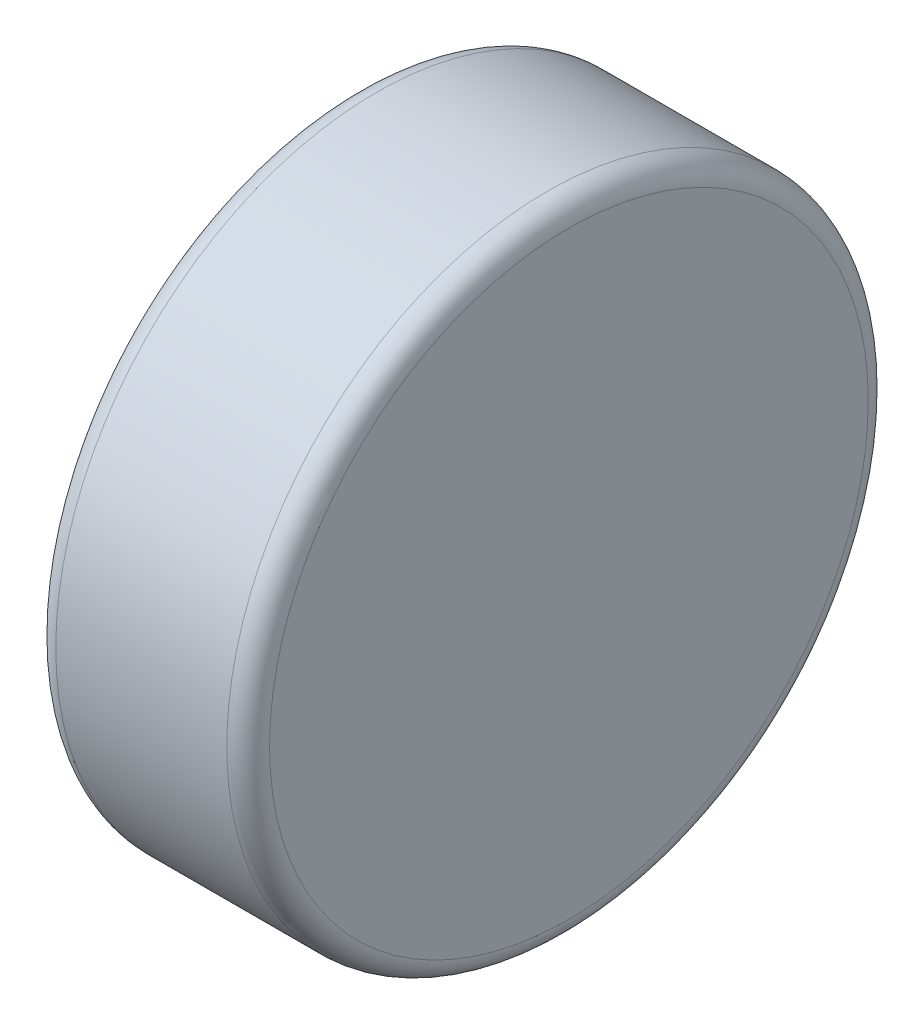
ISO-10303-21;
HEADER;
FILE_DESCRIPTION(('STEP AP214'),'2;1');
FILE_NAME('part.step','',(''),(''),'','','');
FILE_SCHEMA(('AUTOMOTIVE_DESIGN { 1 0 10303 214 1 1 1 1 }'));
ENDSEC;
DATA;
#1=APPLICATION_CONTEXT('core data for automotive mechanical design processes');
#2=APPLICATION_PROTOCOL_DEFINITION('international standard','automotive_design',2000,#1);
#3=PRODUCT_CONTEXT('',#1,'mechanical');
#4=PRODUCT('Part','Part','',(#3));
#5=PRODUCT_RELATED_PRODUCT_CATEGORY('part','',(#4));
#6=PRODUCT_DEFINITION_FORMATION('','',#4);
#7=PRODUCT_DEFINITION_CONTEXT('part definition',#1,'design');
#8=PRODUCT_DEFINITION('design','',#6,#7);
#9=PRODUCT_DEFINITION_SHAPE('','',#8);
#10=(LENGTH_UNIT() NAMED_UNIT(*) SI_UNIT(.MILLI.,.METRE.));
#11=(NAMED_UNIT(*) PLANE_ANGLE_UNIT() SI_UNIT($,.RADIAN.));
#12=(NAMED_UNIT(*) SI_UNIT($,.STERADIAN.) SOLID_ANGLE_UNIT());
#13=UNCERTAINTY_MEASURE_WITH_UNIT(LENGTH_MEASURE(1.E-05),#10,'distance_accuracy_value','');
#14=(GEOMETRIC_REPRESENTATION_CONTEXT(3) GLOBAL_UNCERTAINTY_ASSIGNED_CONTEXT((#13)) GLOBAL_UNIT_ASSIGNED_CONTEXT((#10,
#11,#12)) REPRESENTATION_CONTEXT('',''));
#15=CARTESIAN_POINT('',(0.,0.,0.));
#16=DIRECTION('',(0.,0.,1.));
#17=DIRECTION('',(1.,0.,0.));
#18=AXIS2_PLACEMENT_3D('',#15,#16,#17);
#19=CARTESIAN_POINT('',(0.,0.,0.75));
#20=DIRECTION('',(1.,0.,0.));
#21=DIRECTION('',(0.,0.,-1.));
#22=AXIS2_PLACEMENT_3D('',#19,#20,#21);
#23=PLANE('',#22);
#24=CARTESIAN_POINT('',(0.,0.,0.75));
#25=DIRECTION('',(-1.,0.,0.));
#26=DIRECTION('',(0.,0.,1.));
#27=AXIS2_PLACEMENT_3D('',#24,#25,#26);
#28=CIRCLE('',#27,0.7);
#29=CARTESIAN_POINT('',(0.,0.,1.45));
#30=VERTEX_POINT('',#29);
#31=EDGE_CURVE('E19',#30,#30,#28,.F.);
#32=ORIENTED_EDGE('',*,*,#31,.F.);
#33=EDGE_LOOP('',(#32));
#34=FACE_BOUND('',#33,.T.);
#35=ADVANCED_FACE('F15',(#34),#23,.F.);
#36=CARTESIAN_POINT('',(0.0500000000000005,0.,0.75));
#37=DIRECTION('',(-1.,0.,0.));
#38=DIRECTION('',(0.,0.,1.));
#39=AXIS2_PLACEMENT_3D('',#36,#37,#38);
#40=TOROIDAL_SURFACE('',#39,0.7,0.0500000000000002);
#41=CARTESIAN_POINT('',(0.0499999999999998,0.,0.75));
#42=DIRECTION('',(1.,0.,0.));
#43=DIRECTION('',(0.,0.,-1.));
#44=AXIS2_PLACEMENT_3D('',#41,#42,#43);
#45=CIRCLE('',#44,0.75);
#46=CARTESIAN_POINT('',(0.05,0.,0.));
#47=VERTEX_POINT('',#46);
#48=EDGE_CURVE('E27',#47,#47,#45,.T.);
#49=ORIENTED_EDGE('',*,*,#48,.F.);
#50=EDGE_LOOP('',(#49));
#51=FACE_BOUND('',#50,.T.);
#52=ORIENTED_EDGE('',*,*,#31,.T.);
#53=EDGE_LOOP('',(#52));
#54=FACE_BOUND('',#53,.T.);
#55=ADVANCED_FACE('F36',(#51,#54),#40,.T.);
#56=CARTESIAN_POINT('',(0.,0.,0.75));
#57=DIRECTION('',(1.,0.,0.));
#58=DIRECTION('',(0.,0.,-1.));
#59=AXIS2_PLACEMENT_3D('',#56,#57,#58);
#60=CYLINDRICAL_SURFACE('',#59,0.75);
#61=CARTESIAN_POINT('',(0.45,0.,0.75));
#62=DIRECTION('',(1.,0.,0.));
#63=DIRECTION('',(0.,0.,-1.));
#64=AXIS2_PLACEMENT_3D('',#61,#62,#63);
#65=CIRCLE('',#64,0.75);
#66=CARTESIAN_POINT('',(0.45,0.,0.));
#67=VERTEX_POINT('',#66);
#68=EDGE_CURVE('E23',#67,#67,#65,.T.);
#69=ORIENTED_EDGE('',*,*,#68,.F.);
#70=EDGE_LOOP('',(#69));
#71=FACE_BOUND('',#70,.T.);
#72=ORIENTED_EDGE('',*,*,#48,.T.);
#73=EDGE_LOOP('',(#72));
#74=FACE_BOUND('',#73,.T.);
#75=ADVANCED_FACE('F44',(#71,#74),#60,.T.);
#76=CARTESIAN_POINT('',(0.45,0.,0.75));
#77=DIRECTION('',(1.,0.,0.));
#78=DIRECTION('',(0.,0.,-1.));
#79=AXIS2_PLACEMENT_3D('',#76,#77,#78);
#80=TOROIDAL_SURFACE('',#79,0.7,0.0499999999999999);
#81=CARTESIAN_POINT('',(0.5,0.,0.75));
#82=DIRECTION('',(1.,0.,0.));
#83=DIRECTION('',(0.,0.,-1.));
#84=AXIS2_PLACEMENT_3D('',#81,#82,#83);
#85=CIRCLE('',#84,0.7);
#86=CARTESIAN_POINT('',(0.5,0.,0.0499999999999999));
#87=VERTEX_POINT('',#86);
#88=EDGE_CURVE('E10',#87,#87,#85,.T.);
#89=ORIENTED_EDGE('',*,*,#88,.F.);
#90=EDGE_LOOP('',(#89));
#91=FACE_BOUND('',#90,.T.);
#92=ORIENTED_EDGE('',*,*,#68,.T.);
#93=EDGE_LOOP('',(#92));
#94=FACE_BOUND('',#93,.T.);
#95=ADVANCED_FACE('F17',(#91,#94),#80,.T.);
#96=CARTESIAN_POINT('',(0.5,0.,0.75));
#97=DIRECTION('',(1.,0.,0.));
#98=DIRECTION('',(0.,0.,-1.));
#99=AXIS2_PLACEMENT_3D('',#96,#97,#98);
#100=PLANE('',#99);
#101=ORIENTED_EDGE('',*,*,#88,.T.);
#102=EDGE_LOOP('',(#101));
#103=FACE_BOUND('',#102,.T.);
#104=ADVANCED_FACE('F47',(#103),#100,.T.);
#105=CLOSED_SHELL('',(#35,#55,#75,#95,#104));
#106=MANIFOLD_SOLID_BREP('B1',#105);
#107=ADVANCED_BREP_SHAPE_REPRESENTATION('',(#18,#106),#14);
#108=SHAPE_DEFINITION_REPRESENTATION(#9,#107);
ENDSEC;
END-ISO-10303-21;
